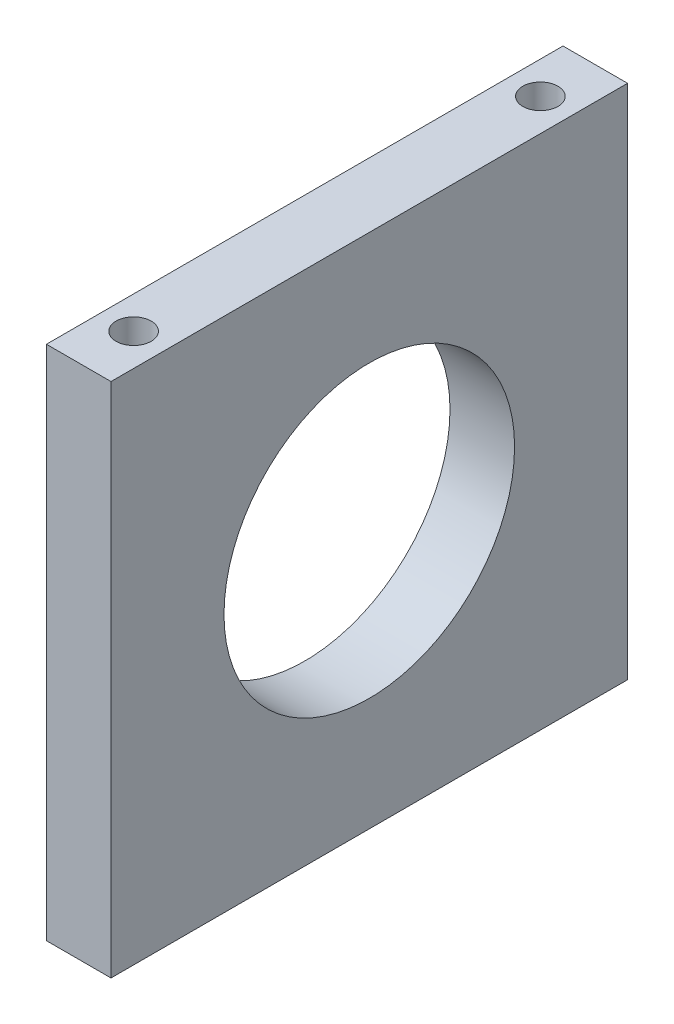
ISO-10303-21;
HEADER;
FILE_DESCRIPTION(('STEP AP214'),'2;1');
FILE_NAME('part.step','',(''),(''),'','','');
FILE_SCHEMA(('AUTOMOTIVE_DESIGN { 1 0 10303 214 1 1 1 1 }'));
ENDSEC;
DATA;
#1=APPLICATION_CONTEXT('core data for automotive mechanical design processes');
#2=APPLICATION_PROTOCOL_DEFINITION('international standard','automotive_design',2000,#1);
#3=PRODUCT_CONTEXT('',#1,'mechanical');
#4=PRODUCT('Part','Part','',(#3));
#5=PRODUCT_RELATED_PRODUCT_CATEGORY('part','',(#4));
#6=PRODUCT_DEFINITION_FORMATION('','',#4);
#7=PRODUCT_DEFINITION_CONTEXT('part definition',#1,'design');
#8=PRODUCT_DEFINITION('design','',#6,#7);
#9=PRODUCT_DEFINITION_SHAPE('','',#8);
#10=(LENGTH_UNIT() NAMED_UNIT(*) SI_UNIT(.MILLI.,.METRE.));
#11=(NAMED_UNIT(*) PLANE_ANGLE_UNIT() SI_UNIT($,.RADIAN.));
#12=(NAMED_UNIT(*) SI_UNIT($,.STERADIAN.) SOLID_ANGLE_UNIT());
#13=UNCERTAINTY_MEASURE_WITH_UNIT(LENGTH_MEASURE(1.E-05),#10,'distance_accuracy_value','');
#14=(GEOMETRIC_REPRESENTATION_CONTEXT(3) GLOBAL_UNCERTAINTY_ASSIGNED_CONTEXT((#13)) GLOBAL_UNIT_ASSIGNED_CONTEXT((#10,
#11,#12)) REPRESENTATION_CONTEXT('',''));
#15=CARTESIAN_POINT('',(0.,0.,0.));
#16=DIRECTION('',(0.,0.,1.));
#17=DIRECTION('',(1.,0.,0.));
#18=AXIS2_PLACEMENT_3D('',#15,#16,#17);
#19=CARTESIAN_POINT('',(3.175,-25.4,0.));
#20=DIRECTION('',(0.,1.,0.));
#21=DIRECTION('',(0.,0.,1.));
#22=AXIS2_PLACEMENT_3D('',#19,#20,#21);
#23=PLANE('',#22);
#24=DIRECTION('',(0.,0.,-1.));
#25=VECTOR('',#24,1.);
#26=CARTESIAN_POINT('',(-3.175,-25.4,0.));
#27=LINE('',#26,#25);
#28=CARTESIAN_POINT('',(-3.175,-25.4,25.4));
#29=VERTEX_POINT('',#28);
#30=CARTESIAN_POINT('',(-3.175,-25.4,-25.4));
#31=VERTEX_POINT('',#30);
#32=EDGE_CURVE('E126',#29,#31,#27,.T.);
#33=ORIENTED_EDGE('',*,*,#32,.T.);
#34=DIRECTION('',(-1.,0.,0.));
#35=VECTOR('',#34,1.);
#36=CARTESIAN_POINT('',(3.175,-25.4,-25.4));
#37=LINE('',#36,#35);
#38=CARTESIAN_POINT('',(3.175,-25.4,-25.4));
#39=VERTEX_POINT('',#38);
#40=EDGE_CURVE('E11',#39,#31,#37,.T.);
#41=ORIENTED_EDGE('',*,*,#40,.F.);
#42=DIRECTION('',(0.,0.,-1.));
#43=VECTOR('',#42,1.);
#44=CARTESIAN_POINT('',(3.175,-25.4,0.));
#45=LINE('',#44,#43);
#46=CARTESIAN_POINT('',(3.175,-25.4,25.4));
#47=VERTEX_POINT('',#46);
#48=EDGE_CURVE('E115',#47,#39,#45,.T.);
#49=ORIENTED_EDGE('',*,*,#48,.F.);
#50=DIRECTION('',(-1.,0.,0.));
#51=VECTOR('',#50,1.);
#52=CARTESIAN_POINT('',(3.175,-25.4,25.4));
#53=LINE('',#52,#51);
#54=EDGE_CURVE('E56',#47,#29,#53,.T.);
#55=ORIENTED_EDGE('',*,*,#54,.T.);
#56=EDGE_LOOP('',(#33,#41,#49,#55));
#57=FACE_BOUND('',#56,.T.);
#58=ADVANCED_FACE('F39',(#57),#23,.F.);
#59=CARTESIAN_POINT('',(3.175,0.,-25.4));
#60=DIRECTION('',(0.,0.,1.));
#61=DIRECTION('',(1.,0.,0.));
#62=AXIS2_PLACEMENT_3D('',#59,#60,#61);
#63=PLANE('',#62);
#64=DIRECTION('',(0.,1.,0.));
#65=VECTOR('',#64,1.);
#66=CARTESIAN_POINT('',(-3.175,0.,-25.4));
#67=LINE('',#66,#65);
#68=CARTESIAN_POINT('',(-3.175,25.4,-25.4));
#69=VERTEX_POINT('',#68);
#70=EDGE_CURVE('E128',#31,#69,#67,.T.);
#71=ORIENTED_EDGE('',*,*,#70,.T.);
#72=DIRECTION('',(-1.,0.,0.));
#73=VECTOR('',#72,1.);
#74=CARTESIAN_POINT('',(3.175,25.4,-25.4));
#75=LINE('',#74,#73);
#76=CARTESIAN_POINT('',(3.175,25.4,-25.4));
#77=VERTEX_POINT('',#76);
#78=EDGE_CURVE('E48',#77,#69,#75,.T.);
#79=ORIENTED_EDGE('',*,*,#78,.F.);
#80=DIRECTION('',(0.,1.,0.));
#81=VECTOR('',#80,1.);
#82=CARTESIAN_POINT('',(3.175,0.,-25.4));
#83=LINE('',#82,#81);
#84=EDGE_CURVE('E82',#39,#77,#83,.T.);
#85=ORIENTED_EDGE('',*,*,#84,.F.);
#86=ORIENTED_EDGE('',*,*,#40,.T.);
#87=EDGE_LOOP('',(#71,#79,#85,#86));
#88=FACE_BOUND('',#87,.T.);
#89=ADVANCED_FACE('F140',(#88),#63,.F.);
#90=CARTESIAN_POINT('',(3.175,25.4,0.));
#91=DIRECTION('',(0.,1.,0.));
#92=DIRECTION('',(0.,0.,1.));
#93=AXIS2_PLACEMENT_3D('',#90,#91,#92);
#94=PLANE('',#93);
#95=CARTESIAN_POINT('',(0.,25.4,20.0025));
#96=DIRECTION('',(0.,1.,0.));
#97=DIRECTION('',(0.,0.,1.));
#98=AXIS2_PLACEMENT_3D('',#95,#96,#97);
#99=CIRCLE('',#98,1.72719999999999);
#100=CARTESIAN_POINT('',(0.,25.4,21.7297));
#101=VERTEX_POINT('',#100);
#102=EDGE_CURVE('E101',#101,#101,#99,.T.);
#103=ORIENTED_EDGE('',*,*,#102,.F.);
#104=EDGE_LOOP('',(#103));
#105=FACE_BOUND('',#104,.T.);
#106=CARTESIAN_POINT('',(0.,25.4,-20.0025));
#107=DIRECTION('',(0.,1.,0.));
#108=DIRECTION('',(0.,0.,1.));
#109=AXIS2_PLACEMENT_3D('',#106,#107,#108);
#110=CIRCLE('',#109,1.72719999999999);
#111=CARTESIAN_POINT('',(0.,25.4,-18.2753));
#112=VERTEX_POINT('',#111);
#113=EDGE_CURVE('E100',#112,#112,#110,.T.);
#114=ORIENTED_EDGE('',*,*,#113,.F.);
#115=EDGE_LOOP('',(#114));
#116=FACE_BOUND('',#115,.T.);
#117=DIRECTION('',(0.,0.,-1.));
#118=VECTOR('',#117,1.);
#119=CARTESIAN_POINT('',(-3.175,25.4,0.));
#120=LINE('',#119,#118);
#121=CARTESIAN_POINT('',(-3.175,25.4,25.4));
#122=VERTEX_POINT('',#121);
#123=EDGE_CURVE('E131',#122,#69,#120,.T.);
#124=ORIENTED_EDGE('',*,*,#123,.F.);
#125=DIRECTION('',(-1.,0.,0.));
#126=VECTOR('',#125,1.);
#127=CARTESIAN_POINT('',(3.175,25.4,25.4));
#128=LINE('',#127,#126);
#129=CARTESIAN_POINT('',(3.175,25.4,25.4));
#130=VERTEX_POINT('',#129);
#131=EDGE_CURVE('E71',#130,#122,#128,.T.);
#132=ORIENTED_EDGE('',*,*,#131,.F.);
#133=DIRECTION('',(0.,0.,-1.));
#134=VECTOR('',#133,1.);
#135=CARTESIAN_POINT('',(3.175,25.4,0.));
#136=LINE('',#135,#134);
#137=EDGE_CURVE('E119',#130,#77,#136,.T.);
#138=ORIENTED_EDGE('',*,*,#137,.T.);
#139=ORIENTED_EDGE('',*,*,#78,.T.);
#140=EDGE_LOOP('',(#124,#132,#138,#139));
#141=FACE_BOUND('',#140,.T.);
#142=ADVANCED_FACE('F138',(#105,#116,#141),#94,.T.);
#143=CARTESIAN_POINT('',(3.175,0.,0.));
#144=DIRECTION('',(-1.,0.,0.));
#145=DIRECTION('',(0.,0.,1.));
#146=AXIS2_PLACEMENT_3D('',#143,#144,#145);
#147=CYLINDRICAL_SURFACE('',#146,14.2875);
#148=CARTESIAN_POINT('',(3.175,0.,0.));
#149=DIRECTION('',(1.,0.,0.));
#150=DIRECTION('',(0.,0.,-1.));
#151=AXIS2_PLACEMENT_3D('',#148,#149,#150);
#152=CIRCLE('',#151,14.2875);
#153=CARTESIAN_POINT('',(3.175,0.,-14.2875));
#154=VERTEX_POINT('',#153);
#155=EDGE_CURVE('E112',#154,#154,#152,.T.);
#156=ORIENTED_EDGE('',*,*,#155,.T.);
#157=EDGE_LOOP('',(#156));
#158=FACE_BOUND('',#157,.T.);
#159=CARTESIAN_POINT('',(-3.175,0.,0.));
#160=DIRECTION('',(1.,0.,0.));
#161=DIRECTION('',(0.,0.,-1.));
#162=AXIS2_PLACEMENT_3D('',#159,#160,#161);
#163=CIRCLE('',#162,14.2875);
#164=CARTESIAN_POINT('',(-3.175,0.,-14.2875));
#165=VERTEX_POINT('',#164);
#166=EDGE_CURVE('E111',#165,#165,#163,.T.);
#167=ORIENTED_EDGE('',*,*,#166,.F.);
#168=EDGE_LOOP('',(#167));
#169=FACE_BOUND('',#168,.T.);
#170=ADVANCED_FACE('F41',(#158,#169),#147,.F.);
#171=CARTESIAN_POINT('',(3.175,0.,25.4));
#172=DIRECTION('',(0.,0.,1.));
#173=DIRECTION('',(1.,0.,0.));
#174=AXIS2_PLACEMENT_3D('',#171,#172,#173);
#175=PLANE('',#174);
#176=DIRECTION('',(0.,1.,0.));
#177=VECTOR('',#176,1.);
#178=CARTESIAN_POINT('',(-3.175,0.,25.4));
#179=LINE('',#178,#177);
#180=EDGE_CURVE('E116',#29,#122,#179,.T.);
#181=ORIENTED_EDGE('',*,*,#180,.F.);
#182=ORIENTED_EDGE('',*,*,#54,.F.);
#183=DIRECTION('',(0.,1.,0.));
#184=VECTOR('',#183,1.);
#185=CARTESIAN_POINT('',(3.175,0.,25.4));
#186=LINE('',#185,#184);
#187=EDGE_CURVE('E122',#47,#130,#186,.T.);
#188=ORIENTED_EDGE('',*,*,#187,.T.);
#189=ORIENTED_EDGE('',*,*,#131,.T.);
#190=EDGE_LOOP('',(#181,#182,#188,#189));
#191=FACE_BOUND('',#190,.T.);
#192=ADVANCED_FACE('F144',(#191),#175,.T.);
#193=CARTESIAN_POINT('',(3.175,0.,0.));
#194=DIRECTION('',(1.,0.,0.));
#195=DIRECTION('',(0.,0.,-1.));
#196=AXIS2_PLACEMENT_3D('',#193,#194,#195);
#197=PLANE('',#196);
#198=ORIENTED_EDGE('',*,*,#155,.F.);
#199=EDGE_LOOP('',(#198));
#200=FACE_BOUND('',#199,.T.);
#201=ORIENTED_EDGE('',*,*,#48,.T.);
#202=ORIENTED_EDGE('',*,*,#84,.T.);
#203=ORIENTED_EDGE('',*,*,#137,.F.);
#204=ORIENTED_EDGE('',*,*,#187,.F.);
#205=EDGE_LOOP('',(#201,#202,#203,#204));
#206=FACE_BOUND('',#205,.T.);
#207=ADVANCED_FACE('F146',(#200,#206),#197,.T.);
#208=CARTESIAN_POINT('',(-3.175,0.,0.));
#209=DIRECTION('',(1.,0.,0.));
#210=DIRECTION('',(0.,0.,-1.));
#211=AXIS2_PLACEMENT_3D('',#208,#209,#210);
#212=PLANE('',#211);
#213=ORIENTED_EDGE('',*,*,#166,.T.);
#214=EDGE_LOOP('',(#213));
#215=FACE_BOUND('',#214,.T.);
#216=ORIENTED_EDGE('',*,*,#32,.F.);
#217=ORIENTED_EDGE('',*,*,#180,.T.);
#218=ORIENTED_EDGE('',*,*,#123,.T.);
#219=ORIENTED_EDGE('',*,*,#70,.F.);
#220=EDGE_LOOP('',(#216,#217,#218,#219));
#221=FACE_BOUND('',#220,.T.);
#222=ADVANCED_FACE('F143',(#215,#221),#212,.F.);
#223=CARTESIAN_POINT('',(0.,-12.7,-20.0025));
#224=DIRECTION('',(0.,1.,0.));
#225=DIRECTION('',(0.,0.,1.));
#226=AXIS2_PLACEMENT_3D('',#223,#224,#225);
#227=CONICAL_SURFACE('',#226,1.72719999999999,1.02974425867665);
#228=CARTESIAN_POINT('',(0.,-13.7378064611844,-20.0025));
#229=VERTEX_POINT('',#228);
#230=VERTEX_LOOP('',#229);
#231=FACE_BOUND('',#230,.T.);
#232=CARTESIAN_POINT('',(0.,-12.7,-20.0025));
#233=DIRECTION('',(0.,1.,0.));
#234=DIRECTION('',(0.,0.,1.));
#235=AXIS2_PLACEMENT_3D('',#232,#233,#234);
#236=CIRCLE('',#235,1.72719999999999);
#237=CARTESIAN_POINT('',(0.,-12.7,-18.2753));
#238=VERTEX_POINT('',#237);
#239=EDGE_CURVE('E104',#238,#238,#236,.T.);
#240=ORIENTED_EDGE('',*,*,#239,.T.);
#241=EDGE_LOOP('',(#240));
#242=FACE_BOUND('',#241,.T.);
#243=ADVANCED_FACE('F171',(#231,#242),#227,.F.);
#244=CARTESIAN_POINT('',(0.,25.4,-20.0025));
#245=DIRECTION('',(0.,1.,0.));
#246=DIRECTION('',(0.,0.,1.));
#247=AXIS2_PLACEMENT_3D('',#244,#245,#246);
#248=CYLINDRICAL_SURFACE('',#247,1.72719999999999);
#249=ORIENTED_EDGE('',*,*,#239,.F.);
#250=EDGE_LOOP('',(#249));
#251=FACE_BOUND('',#250,.T.);
#252=ORIENTED_EDGE('',*,*,#113,.T.);
#253=EDGE_LOOP('',(#252));
#254=FACE_BOUND('',#253,.T.);
#255=ADVANCED_FACE('F94',(#251,#254),#248,.F.);
#256=CARTESIAN_POINT('',(0.,-12.7,20.0025));
#257=DIRECTION('',(0.,1.,0.));
#258=DIRECTION('',(0.,0.,1.));
#259=AXIS2_PLACEMENT_3D('',#256,#257,#258);
#260=CONICAL_SURFACE('',#259,1.72719999999999,1.02974425867665);
#261=CARTESIAN_POINT('',(0.,-13.7378064611844,20.0025));
#262=VERTEX_POINT('',#261);
#263=VERTEX_LOOP('',#262);
#264=FACE_BOUND('',#263,.T.);
#265=CARTESIAN_POINT('',(0.,-12.7,20.0025));
#266=DIRECTION('',(0.,1.,0.));
#267=DIRECTION('',(0.,0.,1.));
#268=AXIS2_PLACEMENT_3D('',#265,#266,#267);
#269=CIRCLE('',#268,1.72719999999999);
#270=CARTESIAN_POINT('',(0.,-12.7,21.7297));
#271=VERTEX_POINT('',#270);
#272=EDGE_CURVE('E98',#271,#271,#269,.T.);
#273=ORIENTED_EDGE('',*,*,#272,.T.);
#274=EDGE_LOOP('',(#273));
#275=FACE_BOUND('',#274,.T.);
#276=ADVANCED_FACE('F90',(#264,#275),#260,.F.);
#277=CARTESIAN_POINT('',(0.,25.4,20.0025));
#278=DIRECTION('',(0.,1.,0.));
#279=DIRECTION('',(0.,0.,1.));
#280=AXIS2_PLACEMENT_3D('',#277,#278,#279);
#281=CYLINDRICAL_SURFACE('',#280,1.72719999999999);
#282=ORIENTED_EDGE('',*,*,#272,.F.);
#283=EDGE_LOOP('',(#282));
#284=FACE_BOUND('',#283,.T.);
#285=ORIENTED_EDGE('',*,*,#102,.T.);
#286=EDGE_LOOP('',(#285));
#287=FACE_BOUND('',#286,.T.);
#288=ADVANCED_FACE('F93',(#284,#287),#281,.F.);
#289=CLOSED_SHELL('',(#58,#89,#142,#170,#192,#207,#222,#243,#255,#276,#288));
#290=MANIFOLD_SOLID_BREP('B2',#289);
#291=ADVANCED_BREP_SHAPE_REPRESENTATION('',(#18,#290),#14);
#292=SHAPE_DEFINITION_REPRESENTATION(#9,#291);
ENDSEC;
END-ISO-10303-21;
